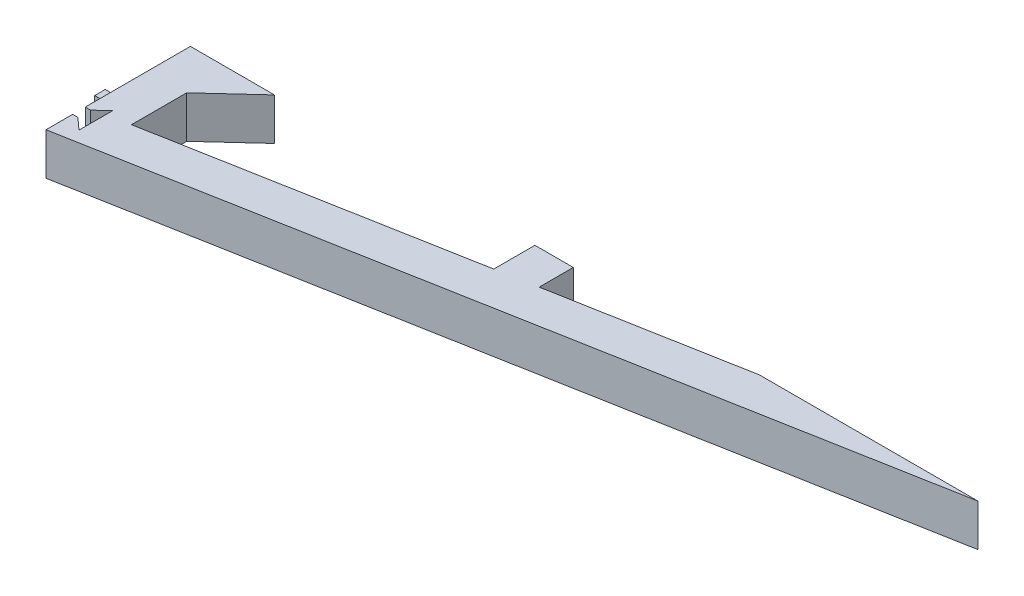
ISO-10303-21;
HEADER;
FILE_DESCRIPTION(('STEP AP214'),'2;1');
FILE_NAME('part.step','',(''),(''),'','','');
FILE_SCHEMA(('AUTOMOTIVE_DESIGN { 1 0 10303 214 1 1 1 1 }'));
ENDSEC;
DATA;
#1=APPLICATION_CONTEXT('core data for automotive mechanical design processes');
#2=APPLICATION_PROTOCOL_DEFINITION('international standard','automotive_design',2000,#1);
#3=PRODUCT_CONTEXT('',#1,'mechanical');
#4=PRODUCT('Part','Part','',(#3));
#5=PRODUCT_RELATED_PRODUCT_CATEGORY('part','',(#4));
#6=PRODUCT_DEFINITION_FORMATION('','',#4);
#7=PRODUCT_DEFINITION_CONTEXT('part definition',#1,'design');
#8=PRODUCT_DEFINITION('design','',#6,#7);
#9=PRODUCT_DEFINITION_SHAPE('','',#8);
#10=(LENGTH_UNIT() NAMED_UNIT(*) SI_UNIT(.MILLI.,.METRE.));
#11=(NAMED_UNIT(*) PLANE_ANGLE_UNIT() SI_UNIT($,.RADIAN.));
#12=(NAMED_UNIT(*) SI_UNIT($,.STERADIAN.) SOLID_ANGLE_UNIT());
#13=UNCERTAINTY_MEASURE_WITH_UNIT(LENGTH_MEASURE(1.E-05),#10,'distance_accuracy_value','');
#14=(GEOMETRIC_REPRESENTATION_CONTEXT(3) GLOBAL_UNCERTAINTY_ASSIGNED_CONTEXT((#13)) GLOBAL_UNIT_ASSIGNED_CONTEXT((#10,
#11,#12)) REPRESENTATION_CONTEXT('',''));
#15=CARTESIAN_POINT('',(0.,0.,0.));
#16=DIRECTION('',(0.,0.,1.));
#17=DIRECTION('',(1.,0.,0.));
#18=AXIS2_PLACEMENT_3D('',#15,#16,#17);
#19=CARTESIAN_POINT('',(0.,8.,0.));
#20=DIRECTION('',(1.,0.,0.));
#21=DIRECTION('',(0.,0.,-1.));
#22=AXIS2_PLACEMENT_3D('',#19,#20,#21);
#23=PLANE('',#22);
#24=DIRECTION('',(0.,1.,0.));
#25=VECTOR('',#24,1.);
#26=CARTESIAN_POINT('',(0.,0.,20.));
#27=LINE('',#26,#25);
#28=CARTESIAN_POINT('',(0.,0.,20.));
#29=VERTEX_POINT('',#28);
#30=CARTESIAN_POINT('',(0.,8.,20.));
#31=VERTEX_POINT('',#30);
#32=EDGE_CURVE('E226',#29,#31,#27,.T.);
#33=ORIENTED_EDGE('',*,*,#32,.T.);
#34=DIRECTION('',(0.,0.,1.));
#35=VECTOR('',#34,1.);
#36=CARTESIAN_POINT('',(0.,8.,0.));
#37=LINE('',#36,#35);
#38=CARTESIAN_POINT('',(0.,8.,0.));
#39=VERTEX_POINT('',#38);
#40=EDGE_CURVE('E198',#39,#31,#37,.T.);
#41=ORIENTED_EDGE('',*,*,#40,.F.);
#42=DIRECTION('',(0.,-1.,0.));
#43=VECTOR('',#42,1.);
#44=CARTESIAN_POINT('',(0.,8.,0.));
#45=LINE('',#44,#43);
#46=CARTESIAN_POINT('',(0.,0.,0.));
#47=VERTEX_POINT('',#46);
#48=EDGE_CURVE('E11',#39,#47,#45,.T.);
#49=ORIENTED_EDGE('',*,*,#48,.T.);
#50=DIRECTION('',(0.,0.,1.));
#51=VECTOR('',#50,1.);
#52=CARTESIAN_POINT('',(0.,0.,0.));
#53=LINE('',#52,#51);
#54=EDGE_CURVE('E227',#47,#29,#53,.T.);
#55=ORIENTED_EDGE('',*,*,#54,.T.);
#56=EDGE_LOOP('',(#33,#41,#49,#55));
#57=FACE_BOUND('',#56,.T.);
#58=DIRECTION('',(0.,-1.,0.));
#59=VECTOR('',#58,1.);
#60=CARTESIAN_POINT('',(0.,5.,12.2));
#61=LINE('',#60,#59);
#62=CARTESIAN_POINT('',(0.,5.,12.2));
#63=VERTEX_POINT('',#62);
#64=CARTESIAN_POINT('',(0.,3.,12.2));
#65=VERTEX_POINT('',#64);
#66=EDGE_CURVE('E362',#63,#65,#61,.T.);
#67=ORIENTED_EDGE('',*,*,#66,.F.);
#68=DIRECTION('',(0.,0.,-1.));
#69=VECTOR('',#68,1.);
#70=CARTESIAN_POINT('',(0.,5.,12.2));
#71=LINE('',#70,#69);
#72=CARTESIAN_POINT('',(0.,5.,14.2));
#73=VERTEX_POINT('',#72);
#74=EDGE_CURVE('E356',#73,#63,#71,.T.);
#75=ORIENTED_EDGE('',*,*,#74,.F.);
#76=DIRECTION('',(0.,1.,0.));
#77=VECTOR('',#76,1.);
#78=CARTESIAN_POINT('',(0.,5.,14.2));
#79=LINE('',#78,#77);
#80=CARTESIAN_POINT('',(0.,3.,14.2));
#81=VERTEX_POINT('',#80);
#82=EDGE_CURVE('E53',#81,#73,#79,.T.);
#83=ORIENTED_EDGE('',*,*,#82,.F.);
#84=DIRECTION('',(0.,0.,1.));
#85=VECTOR('',#84,1.);
#86=CARTESIAN_POINT('',(0.,3.,12.2));
#87=LINE('',#86,#85);
#88=EDGE_CURVE('E48',#65,#81,#87,.T.);
#89=ORIENTED_EDGE('',*,*,#88,.F.);
#90=EDGE_LOOP('',(#67,#75,#83,#89));
#91=FACE_BOUND('',#90,.T.);
#92=ADVANCED_FACE('F33',(#57,#91),#23,.F.);
#93=CARTESIAN_POINT('',(7.3,8.,0.));
#94=DIRECTION('',(0.,0.,1.));
#95=DIRECTION('',(1.,0.,0.));
#96=AXIS2_PLACEMENT_3D('',#93,#94,#95);
#97=PLANE('',#96);
#98=CARTESIAN_POINT('',(3.65,4.,0.));
#99=DIRECTION('',(0.,0.,-1.));
#100=DIRECTION('',(-1.,0.,0.));
#101=AXIS2_PLACEMENT_3D('',#98,#99,#100);
#102=CIRCLE('',#101,2.2);
#103=CARTESIAN_POINT('',(1.45,4.,0.));
#104=VERTEX_POINT('',#103);
#105=EDGE_CURVE('E381',#104,#104,#102,.T.);
#106=ORIENTED_EDGE('',*,*,#105,.F.);
#107=EDGE_LOOP('',(#106));
#108=FACE_BOUND('',#107,.T.);
#109=DIRECTION('',(-1.,0.,0.));
#110=VECTOR('',#109,1.);
#111=CARTESIAN_POINT('',(7.3,0.,0.));
#112=LINE('',#111,#110);
#113=CARTESIAN_POINT('',(16.,0.,0.));
#114=VERTEX_POINT('',#113);
#115=EDGE_CURVE('E223',#114,#47,#112,.T.);
#116=ORIENTED_EDGE('',*,*,#115,.T.);
#117=ORIENTED_EDGE('',*,*,#48,.F.);
#118=DIRECTION('',(-1.,0.,0.));
#119=VECTOR('',#118,1.);
#120=CARTESIAN_POINT('',(7.3,8.,0.));
#121=LINE('',#120,#119);
#122=CARTESIAN_POINT('',(16.,8.,0.));
#123=VERTEX_POINT('',#122);
#124=EDGE_CURVE('E190',#123,#39,#121,.T.);
#125=ORIENTED_EDGE('',*,*,#124,.F.);
#126=DIRECTION('',(0.,1.,0.));
#127=VECTOR('',#126,1.);
#128=CARTESIAN_POINT('',(16.,0.,0.));
#129=LINE('',#128,#127);
#130=EDGE_CURVE('E173',#114,#123,#129,.T.);
#131=ORIENTED_EDGE('',*,*,#130,.F.);
#132=EDGE_LOOP('',(#116,#117,#125,#131));
#133=FACE_BOUND('',#132,.T.);
#134=ADVANCED_FACE('F35',(#108,#133),#97,.F.);
#135=CARTESIAN_POINT('',(0.,8.,22.4));
#136=VERTEX_POINT('',#135);
#137=CARTESIAN_POINT('',(0.,8.,27.47211487));
#138=VERTEX_POINT('',#137);
#139=EDGE_CURVE('E195',#136,#138,#37,.T.);
#140=ORIENTED_EDGE('',*,*,#139,.F.);
#141=DIRECTION('',(0.,1.,0.));
#142=VECTOR('',#141,1.);
#143=CARTESIAN_POINT('',(0.,0.,22.4));
#144=LINE('',#143,#142);
#145=CARTESIAN_POINT('',(0.,0.,22.4));
#146=VERTEX_POINT('',#145);
#147=EDGE_CURVE('E204',#146,#136,#144,.T.);
#148=ORIENTED_EDGE('',*,*,#147,.F.);
#149=CARTESIAN_POINT('',(0.,0.,27.47211487));
#150=VERTEX_POINT('',#149);
#151=EDGE_CURVE('E225',#146,#150,#53,.T.);
#152=ORIENTED_EDGE('',*,*,#151,.T.);
#153=DIRECTION('',(0.,-1.,0.));
#154=VECTOR('',#153,1.);
#155=CARTESIAN_POINT('',(0.,8.,27.47211487));
#156=LINE('',#155,#154);
#157=EDGE_CURVE('E41',#138,#150,#156,.T.);
#158=ORIENTED_EDGE('',*,*,#157,.F.);
#159=EDGE_LOOP('',(#140,#148,#152,#158));
#160=FACE_BOUND('',#159,.T.);
#161=ADVANCED_FACE('F292',(#160),#23,.F.);
#162=CARTESIAN_POINT('',(0.,8.,27.47211487));
#163=DIRECTION('',(-0.180330309758335,0.,-0.983606109874508));
#164=DIRECTION('',(-0.983606109874508,0.,0.180330309758335));
#165=AXIS2_PLACEMENT_3D('',#162,#163,#164);
#166=PLANE('',#165);
#167=DIRECTION('',(0.983606109874508,0.,-0.180330309758335));
#168=VECTOR('',#167,1.);
#169=CARTESIAN_POINT('',(0.,0.,27.47211487));
#170=LINE('',#169,#168);
#171=CARTESIAN_POINT('',(149.85,0.,-0.000769494996585678));
#172=VERTEX_POINT('',#171);
#173=EDGE_CURVE('E229',#150,#172,#170,.T.);
#174=ORIENTED_EDGE('',*,*,#173,.T.);
#175=DIRECTION('',(0.,-1.,0.));
#176=VECTOR('',#175,1.);
#177=CARTESIAN_POINT('',(149.85,8.,-0.000769494996585678));
#178=LINE('',#177,#176);
#179=CARTESIAN_POINT('',(149.85,8.,-0.000769494996585678));
#180=VERTEX_POINT('',#179);
#181=EDGE_CURVE('E259',#180,#172,#178,.T.);
#182=ORIENTED_EDGE('',*,*,#181,.F.);
#183=DIRECTION('',(0.983606109874508,0.,-0.180330309758335));
#184=VECTOR('',#183,1.);
#185=CARTESIAN_POINT('',(0.,8.,27.47211487));
#186=LINE('',#185,#184);
#187=EDGE_CURVE('E207',#138,#180,#186,.T.);
#188=ORIENTED_EDGE('',*,*,#187,.F.);
#189=ORIENTED_EDGE('',*,*,#157,.T.);
#190=EDGE_LOOP('',(#174,#182,#188,#189));
#191=FACE_BOUND('',#190,.T.);
#192=ADVANCED_FACE('F266',(#191),#166,.F.);
#193=CARTESIAN_POINT('',(108.259653873212,8.,-0.000769494996586111));
#194=DIRECTION('',(0.,0.,1.));
#195=DIRECTION('',(1.,0.,0.));
#196=AXIS2_PLACEMENT_3D('',#193,#194,#195);
#197=PLANE('',#196);
#198=DIRECTION('',(-1.,0.,0.));
#199=VECTOR('',#198,1.);
#200=CARTESIAN_POINT('',(108.259653873212,0.,-0.000769494996586111));
#201=LINE('',#200,#199);
#202=CARTESIAN_POINT('',(108.259653873212,0.,-0.000769494996586111));
#203=VERTEX_POINT('',#202);
#204=EDGE_CURVE('E231',#172,#203,#201,.T.);
#205=ORIENTED_EDGE('',*,*,#204,.T.);
#206=DIRECTION('',(0.,-1.,0.));
#207=VECTOR('',#206,1.);
#208=CARTESIAN_POINT('',(108.259653873212,8.,-0.000769494996586111));
#209=LINE('',#208,#207);
#210=CARTESIAN_POINT('',(108.259653873212,8.,-0.000769494996586111));
#211=VERTEX_POINT('',#210);
#212=EDGE_CURVE('E256',#211,#203,#209,.T.);
#213=ORIENTED_EDGE('',*,*,#212,.F.);
#214=DIRECTION('',(-1.,0.,0.));
#215=VECTOR('',#214,1.);
#216=CARTESIAN_POINT('',(108.259653873212,8.,-0.000769494996586111));
#217=LINE('',#216,#215);
#218=EDGE_CURVE('E209',#180,#211,#217,.T.);
#219=ORIENTED_EDGE('',*,*,#218,.F.);
#220=ORIENTED_EDGE('',*,*,#181,.T.);
#221=EDGE_LOOP('',(#205,#213,#219,#220));
#222=FACE_BOUND('',#221,.T.);
#223=ADVANCED_FACE('F279',(#222),#197,.F.);
#224=CARTESIAN_POINT('',(72.85,8.,6.4910912074613));
#225=DIRECTION('',(0.180330309758335,0.,0.983606109874508));
#226=DIRECTION('',(0.983606109874508,0.,-0.180330309758335));
#227=AXIS2_PLACEMENT_3D('',#224,#225,#226);
#228=PLANE('',#227);
#229=DIRECTION('',(-0.983606109874508,0.,0.180330309758335));
#230=VECTOR('',#229,1.);
#231=CARTESIAN_POINT('',(72.85,0.,6.4910912074613));
#232=LINE('',#231,#230);
#233=CARTESIAN_POINT('',(72.85,0.,6.4910912074613));
#234=VERTEX_POINT('',#233);
#235=EDGE_CURVE('E233',#203,#234,#232,.T.);
#236=ORIENTED_EDGE('',*,*,#235,.T.);
#237=DIRECTION('',(0.,-1.,0.));
#238=VECTOR('',#237,1.);
#239=CARTESIAN_POINT('',(72.85,8.,6.4910912074613));
#240=LINE('',#239,#238);
#241=CARTESIAN_POINT('',(72.85,8.,6.4910912074613));
#242=VERTEX_POINT('',#241);
#243=EDGE_CURVE('E253',#242,#234,#240,.T.);
#244=ORIENTED_EDGE('',*,*,#243,.F.);
#245=DIRECTION('',(-0.983606109874508,0.,0.180330309758335));
#246=VECTOR('',#245,1.);
#247=CARTESIAN_POINT('',(72.85,8.,6.4910912074613));
#248=LINE('',#247,#246);
#249=EDGE_CURVE('E211',#211,#242,#248,.T.);
#250=ORIENTED_EDGE('',*,*,#249,.F.);
#251=ORIENTED_EDGE('',*,*,#212,.T.);
#252=EDGE_LOOP('',(#236,#244,#250,#251));
#253=FACE_BOUND('',#252,.T.);
#254=ADVANCED_FACE('F283',(#253),#228,.F.);
#255=CARTESIAN_POINT('',(72.85,8.,0.));
#256=DIRECTION('',(-1.,0.,0.));
#257=DIRECTION('',(0.,0.,1.));
#258=AXIS2_PLACEMENT_3D('',#255,#256,#257);
#259=PLANE('',#258);
#260=DIRECTION('',(0.,0.,-1.));
#261=VECTOR('',#260,1.);
#262=CARTESIAN_POINT('',(72.85,0.,0.));
#263=LINE('',#262,#261);
#264=CARTESIAN_POINT('',(72.85,0.,0.));
#265=VERTEX_POINT('',#264);
#266=EDGE_CURVE('E235',#234,#265,#263,.T.);
#267=ORIENTED_EDGE('',*,*,#266,.T.);
#268=DIRECTION('',(0.,-1.,0.));
#269=VECTOR('',#268,1.);
#270=CARTESIAN_POINT('',(72.85,8.,0.));
#271=LINE('',#270,#269);
#272=CARTESIAN_POINT('',(72.85,8.,0.));
#273=VERTEX_POINT('',#272);
#274=EDGE_CURVE('E250',#273,#265,#271,.T.);
#275=ORIENTED_EDGE('',*,*,#274,.F.);
#276=DIRECTION('',(0.,0.,-1.));
#277=VECTOR('',#276,1.);
#278=CARTESIAN_POINT('',(72.85,8.,0.));
#279=LINE('',#278,#277);
#280=EDGE_CURVE('E213',#242,#273,#279,.T.);
#281=ORIENTED_EDGE('',*,*,#280,.F.);
#282=ORIENTED_EDGE('',*,*,#243,.T.);
#283=EDGE_LOOP('',(#267,#275,#281,#282));
#284=FACE_BOUND('',#283,.T.);
#285=ADVANCED_FACE('F411',(#284),#259,.F.);
#286=CARTESIAN_POINT('',(65.55,8.,0.));
#287=DIRECTION('',(0.,0.,1.));
#288=DIRECTION('',(1.,0.,0.));
#289=AXIS2_PLACEMENT_3D('',#286,#287,#288);
#290=PLANE('',#289);
#291=CARTESIAN_POINT('',(69.2,4.,0.));
#292=DIRECTION('',(0.,0.,-1.));
#293=DIRECTION('',(-1.,0.,0.));
#294=AXIS2_PLACEMENT_3D('',#291,#292,#293);
#295=CIRCLE('',#294,2.2);
#296=CARTESIAN_POINT('',(67.,4.,0.));
#297=VERTEX_POINT('',#296);
#298=EDGE_CURVE('E375',#297,#297,#295,.T.);
#299=ORIENTED_EDGE('',*,*,#298,.F.);
#300=EDGE_LOOP('',(#299));
#301=FACE_BOUND('',#300,.T.);
#302=DIRECTION('',(-1.,0.,0.));
#303=VECTOR('',#302,1.);
#304=CARTESIAN_POINT('',(65.55,0.,0.));
#305=LINE('',#304,#303);
#306=CARTESIAN_POINT('',(65.55,0.,0.));
#307=VERTEX_POINT('',#306);
#308=EDGE_CURVE('E237',#265,#307,#305,.T.);
#309=ORIENTED_EDGE('',*,*,#308,.T.);
#310=DIRECTION('',(0.,-1.,0.));
#311=VECTOR('',#310,1.);
#312=CARTESIAN_POINT('',(65.55,8.,0.));
#313=LINE('',#312,#311);
#314=CARTESIAN_POINT('',(65.55,8.,0.));
#315=VERTEX_POINT('',#314);
#316=EDGE_CURVE('E247',#315,#307,#313,.T.);
#317=ORIENTED_EDGE('',*,*,#316,.F.);
#318=DIRECTION('',(-1.,0.,0.));
#319=VECTOR('',#318,1.);
#320=CARTESIAN_POINT('',(65.55,8.,0.));
#321=LINE('',#320,#319);
#322=EDGE_CURVE('E215',#273,#315,#321,.T.);
#323=ORIENTED_EDGE('',*,*,#322,.F.);
#324=ORIENTED_EDGE('',*,*,#274,.T.);
#325=EDGE_LOOP('',(#309,#317,#323,#324));
#326=FACE_BOUND('',#325,.T.);
#327=ADVANCED_FACE('F414',(#301,#326),#290,.F.);
#328=CARTESIAN_POINT('',(65.55,8.,7.82944326528229));
#329=DIRECTION('',(1.,0.,0.));
#330=DIRECTION('',(0.,0.,-1.));
#331=AXIS2_PLACEMENT_3D('',#328,#329,#330);
#332=PLANE('',#331);
#333=DIRECTION('',(0.,0.,1.));
#334=VECTOR('',#333,1.);
#335=CARTESIAN_POINT('',(65.55,0.,7.82944326528229));
#336=LINE('',#335,#334);
#337=CARTESIAN_POINT('',(65.55,0.,7.82944326528229));
#338=VERTEX_POINT('',#337);
#339=EDGE_CURVE('E239',#307,#338,#336,.T.);
#340=ORIENTED_EDGE('',*,*,#339,.T.);
#341=DIRECTION('',(0.,-1.,0.));
#342=VECTOR('',#341,1.);
#343=CARTESIAN_POINT('',(65.55,8.,7.82944326528229));
#344=LINE('',#343,#342);
#345=CARTESIAN_POINT('',(65.55,8.,7.82944326528229));
#346=VERTEX_POINT('',#345);
#347=EDGE_CURVE('E244',#346,#338,#344,.T.);
#348=ORIENTED_EDGE('',*,*,#347,.F.);
#349=DIRECTION('',(0.,0.,1.));
#350=VECTOR('',#349,1.);
#351=CARTESIAN_POINT('',(65.55,8.,7.82944326528229));
#352=LINE('',#351,#350);
#353=EDGE_CURVE('E217',#315,#346,#352,.T.);
#354=ORIENTED_EDGE('',*,*,#353,.F.);
#355=ORIENTED_EDGE('',*,*,#316,.T.);
#356=EDGE_LOOP('',(#340,#348,#354,#355));
#357=FACE_BOUND('',#356,.T.);
#358=ADVANCED_FACE('F418',(#357),#332,.F.);
#359=CARTESIAN_POINT('',(65.55,8.,7.82944326528229));
#360=DIRECTION('',(0.180330309758335,0.,0.983606109874508));
#361=DIRECTION('',(0.983606109874508,0.,-0.180330309758335));
#362=AXIS2_PLACEMENT_3D('',#359,#360,#361);
#363=PLANE('',#362);
#364=DIRECTION('',(-0.983606109874508,0.,0.180330309758335));
#365=VECTOR('',#364,1.);
#366=CARTESIAN_POINT('',(65.55,0.,7.82944326528229));
#367=LINE('',#366,#365);
#368=CARTESIAN_POINT('',(7.3,0.,18.5087593431005));
#369=VERTEX_POINT('',#368);
#370=EDGE_CURVE('E201',#338,#369,#367,.T.);
#371=ORIENTED_EDGE('',*,*,#370,.T.);
#372=DIRECTION('',(0.,-1.,0.));
#373=VECTOR('',#372,1.);
#374=CARTESIAN_POINT('',(7.3,8.,18.5087593431005));
#375=LINE('',#374,#373);
#376=CARTESIAN_POINT('',(7.3,8.,18.5087593431005));
#377=VERTEX_POINT('',#376);
#378=EDGE_CURVE('E222',#377,#369,#375,.T.);
#379=ORIENTED_EDGE('',*,*,#378,.F.);
#380=DIRECTION('',(-0.983606109874508,0.,0.180330309758335));
#381=VECTOR('',#380,1.);
#382=CARTESIAN_POINT('',(65.55,8.,7.82944326528229));
#383=LINE('',#382,#381);
#384=EDGE_CURVE('E219',#346,#377,#383,.T.);
#385=ORIENTED_EDGE('',*,*,#384,.F.);
#386=ORIENTED_EDGE('',*,*,#347,.T.);
#387=EDGE_LOOP('',(#371,#379,#385,#386));
#388=FACE_BOUND('',#387,.T.);
#389=ADVANCED_FACE('F422',(#388),#363,.F.);
#390=CARTESIAN_POINT('',(7.3,8.,18.5087593431005));
#391=DIRECTION('',(-1.,0.,0.));
#392=DIRECTION('',(0.,0.,1.));
#393=AXIS2_PLACEMENT_3D('',#390,#391,#392);
#394=PLANE('',#393);
#395=DIRECTION('',(0.,0.,-1.));
#396=VECTOR('',#395,1.);
#397=CARTESIAN_POINT('',(7.3,0.,18.5087593431005));
#398=LINE('',#397,#396);
#399=CARTESIAN_POINT('',(7.3,0.,8.));
#400=VERTEX_POINT('',#399);
#401=EDGE_CURVE('E196',#369,#400,#398,.T.);
#402=ORIENTED_EDGE('',*,*,#401,.T.);
#403=DIRECTION('',(0.,1.,0.));
#404=VECTOR('',#403,1.);
#405=CARTESIAN_POINT('',(7.3,8.,8.));
#406=LINE('',#405,#404);
#407=CARTESIAN_POINT('',(7.3,8.,8.));
#408=VERTEX_POINT('',#407);
#409=EDGE_CURVE('E184',#400,#408,#406,.T.);
#410=ORIENTED_EDGE('',*,*,#409,.T.);
#411=DIRECTION('',(0.,0.,-1.));
#412=VECTOR('',#411,1.);
#413=CARTESIAN_POINT('',(7.3,8.,18.5087593431005));
#414=LINE('',#413,#412);
#415=EDGE_CURVE('E193',#377,#408,#414,.T.);
#416=ORIENTED_EDGE('',*,*,#415,.F.);
#417=ORIENTED_EDGE('',*,*,#378,.T.);
#418=EDGE_LOOP('',(#402,#410,#416,#417));
#419=FACE_BOUND('',#418,.T.);
#420=ADVANCED_FACE('F426',(#419),#394,.F.);
#421=CARTESIAN_POINT('',(0.,8.,0.));
#422=DIRECTION('',(0.,1.,0.));
#423=DIRECTION('',(0.,0.,1.));
#424=AXIS2_PLACEMENT_3D('',#421,#422,#423);
#425=PLANE('',#424);
#426=DIRECTION('',(0.736099620693866,0.,-0.676873214431141));
#427=VECTOR('',#426,1.);
#428=CARTESIAN_POINT('',(16.,8.,0.));
#429=LINE('',#428,#427);
#430=EDGE_CURVE('E176',#408,#123,#429,.T.);
#431=ORIENTED_EDGE('',*,*,#430,.T.);
#432=ORIENTED_EDGE('',*,*,#124,.T.);
#433=ORIENTED_EDGE('',*,*,#40,.T.);
#434=DIRECTION('',(-1.,0.,0.));
#435=VECTOR('',#434,1.);
#436=CARTESIAN_POINT('',(0.,8.,20.));
#437=LINE('',#436,#435);
#438=CARTESIAN_POINT('',(1.,8.,20.));
#439=VERTEX_POINT('',#438);
#440=EDGE_CURVE('E317',#439,#31,#437,.T.);
#441=ORIENTED_EDGE('',*,*,#440,.F.);
#442=DIRECTION('',(-0.739940073395944,0.,0.672672793996312));
#443=VECTOR('',#442,1.);
#444=CARTESIAN_POINT('',(1.,8.,20.));
#445=LINE('',#444,#443);
#446=CARTESIAN_POINT('',(3.2,8.,18.));
#447=VERTEX_POINT('',#446);
#448=EDGE_CURVE('E314',#447,#439,#445,.T.);
#449=ORIENTED_EDGE('',*,*,#448,.F.);
#450=DIRECTION('',(0.,0.,-1.));
#451=VECTOR('',#450,1.);
#452=CARTESIAN_POINT('',(3.2,8.,18.));
#453=LINE('',#452,#451);
#454=CARTESIAN_POINT('',(3.2,8.,24.4));
#455=VERTEX_POINT('',#454);
#456=EDGE_CURVE('E311',#455,#447,#453,.T.);
#457=ORIENTED_EDGE('',*,*,#456,.F.);
#458=DIRECTION('',(0.739940073395943,0.,0.672672793996313));
#459=VECTOR('',#458,1.);
#460=CARTESIAN_POINT('',(3.2,8.,24.4));
#461=LINE('',#460,#459);
#462=CARTESIAN_POINT('',(1.,8.,22.4));
#463=VERTEX_POINT('',#462);
#464=EDGE_CURVE('E307',#463,#455,#461,.T.);
#465=ORIENTED_EDGE('',*,*,#464,.F.);
#466=DIRECTION('',(1.,0.,0.));
#467=VECTOR('',#466,1.);
#468=CARTESIAN_POINT('',(1.,8.,22.4));
#469=LINE('',#468,#467);
#470=EDGE_CURVE('E290',#136,#463,#469,.T.);
#471=ORIENTED_EDGE('',*,*,#470,.F.);
#472=ORIENTED_EDGE('',*,*,#139,.T.);
#473=ORIENTED_EDGE('',*,*,#187,.T.);
#474=ORIENTED_EDGE('',*,*,#218,.T.);
#475=ORIENTED_EDGE('',*,*,#249,.T.);
#476=ORIENTED_EDGE('',*,*,#280,.T.);
#477=ORIENTED_EDGE('',*,*,#322,.T.);
#478=ORIENTED_EDGE('',*,*,#353,.T.);
#479=ORIENTED_EDGE('',*,*,#384,.T.);
#480=ORIENTED_EDGE('',*,*,#415,.T.);
#481=EDGE_LOOP('',(#431,#432,#433,#441,#449,#457,#465,#471,#472,#473,#474,#475,#476,#477,#478,
#479,#480));
#482=FACE_BOUND('',#481,.T.);
#483=ADVANCED_FACE('F189',(#482),#425,.T.);
#484=CARTESIAN_POINT('',(0.,0.,0.));
#485=DIRECTION('',(0.,1.,0.));
#486=DIRECTION('',(0.,0.,1.));
#487=AXIS2_PLACEMENT_3D('',#484,#485,#486);
#488=PLANE('',#487);
#489=ORIENTED_EDGE('',*,*,#115,.F.);
#490=DIRECTION('',(0.736099620693866,0.,-0.676873214431141));
#491=VECTOR('',#490,1.);
#492=CARTESIAN_POINT('',(16.,0.,0.));
#493=LINE('',#492,#491);
#494=EDGE_CURVE('E179',#400,#114,#493,.T.);
#495=ORIENTED_EDGE('',*,*,#494,.F.);
#496=ORIENTED_EDGE('',*,*,#401,.F.);
#497=ORIENTED_EDGE('',*,*,#370,.F.);
#498=ORIENTED_EDGE('',*,*,#339,.F.);
#499=ORIENTED_EDGE('',*,*,#308,.F.);
#500=ORIENTED_EDGE('',*,*,#266,.F.);
#501=ORIENTED_EDGE('',*,*,#235,.F.);
#502=ORIENTED_EDGE('',*,*,#204,.F.);
#503=ORIENTED_EDGE('',*,*,#173,.F.);
#504=ORIENTED_EDGE('',*,*,#151,.F.);
#505=DIRECTION('',(1.,0.,0.));
#506=VECTOR('',#505,1.);
#507=CARTESIAN_POINT('',(1.,0.,22.4));
#508=LINE('',#507,#506);
#509=CARTESIAN_POINT('',(1.,0.,22.4));
#510=VERTEX_POINT('',#509);
#511=EDGE_CURVE('E320',#146,#510,#508,.T.);
#512=ORIENTED_EDGE('',*,*,#511,.T.);
#513=DIRECTION('',(0.739940073395943,0.,0.672672793996313));
#514=VECTOR('',#513,1.);
#515=CARTESIAN_POINT('',(3.2,0.,24.4));
#516=LINE('',#515,#514);
#517=CARTESIAN_POINT('',(3.2,0.,24.4));
#518=VERTEX_POINT('',#517);
#519=EDGE_CURVE('E341',#510,#518,#516,.T.);
#520=ORIENTED_EDGE('',*,*,#519,.T.);
#521=DIRECTION('',(0.,0.,-1.));
#522=VECTOR('',#521,1.);
#523=CARTESIAN_POINT('',(3.2,0.,18.));
#524=LINE('',#523,#522);
#525=CARTESIAN_POINT('',(3.2,0.,18.));
#526=VERTEX_POINT('',#525);
#527=EDGE_CURVE('E302',#518,#526,#524,.T.);
#528=ORIENTED_EDGE('',*,*,#527,.T.);
#529=DIRECTION('',(-0.739940073395944,0.,0.672672793996312));
#530=VECTOR('',#529,1.);
#531=CARTESIAN_POINT('',(1.,0.,20.));
#532=LINE('',#531,#530);
#533=CARTESIAN_POINT('',(1.,0.,20.));
#534=VERTEX_POINT('',#533);
#535=EDGE_CURVE('E298',#526,#534,#532,.T.);
#536=ORIENTED_EDGE('',*,*,#535,.T.);
#537=DIRECTION('',(-1.,0.,0.));
#538=VECTOR('',#537,1.);
#539=CARTESIAN_POINT('',(0.,0.,20.));
#540=LINE('',#539,#538);
#541=EDGE_CURVE('E295',#534,#29,#540,.T.);
#542=ORIENTED_EDGE('',*,*,#541,.T.);
#543=ORIENTED_EDGE('',*,*,#54,.F.);
#544=EDGE_LOOP('',(#489,#495,#496,#497,#498,#499,#500,#501,#502,#503,#504,#512,#520,#528,#536,
#542,#543));
#545=FACE_BOUND('',#544,.T.);
#546=ADVANCED_FACE('F273',(#545),#488,.F.);
#547=CARTESIAN_POINT('',(0.,0.,20.));
#548=DIRECTION('',(0.,0.,-1.));
#549=DIRECTION('',(-1.,0.,0.));
#550=AXIS2_PLACEMENT_3D('',#547,#548,#549);
#551=PLANE('',#550);
#552=ORIENTED_EDGE('',*,*,#440,.T.);
#553=ORIENTED_EDGE('',*,*,#32,.F.);
#554=ORIENTED_EDGE('',*,*,#541,.F.);
#555=DIRECTION('',(0.,1.,0.));
#556=VECTOR('',#555,1.);
#557=CARTESIAN_POINT('',(1.,0.,20.));
#558=LINE('',#557,#556);
#559=EDGE_CURVE('E323',#534,#439,#558,.T.);
#560=ORIENTED_EDGE('',*,*,#559,.T.);
#561=EDGE_LOOP('',(#552,#553,#554,#560));
#562=FACE_BOUND('',#561,.T.);
#563=ADVANCED_FACE('F433',(#562),#551,.F.);
#564=CARTESIAN_POINT('',(1.,0.,20.));
#565=DIRECTION('',(-0.672672793996312,0.,-0.739940073395944));
#566=DIRECTION('',(-0.739940073395944,0.,0.672672793996312));
#567=AXIS2_PLACEMENT_3D('',#564,#565,#566);
#568=PLANE('',#567);
#569=ORIENTED_EDGE('',*,*,#448,.T.);
#570=ORIENTED_EDGE('',*,*,#559,.F.);
#571=ORIENTED_EDGE('',*,*,#535,.F.);
#572=DIRECTION('',(0.,1.,0.));
#573=VECTOR('',#572,1.);
#574=CARTESIAN_POINT('',(3.2,0.,18.));
#575=LINE('',#574,#573);
#576=EDGE_CURVE('E325',#526,#447,#575,.T.);
#577=ORIENTED_EDGE('',*,*,#576,.T.);
#578=EDGE_LOOP('',(#569,#570,#571,#577));
#579=FACE_BOUND('',#578,.T.);
#580=ADVANCED_FACE('F339',(#579),#568,.F.);
#581=CARTESIAN_POINT('',(3.2,0.,18.));
#582=DIRECTION('',(1.,0.,0.));
#583=DIRECTION('',(0.,0.,-1.));
#584=AXIS2_PLACEMENT_3D('',#581,#582,#583);
#585=PLANE('',#584);
#586=ORIENTED_EDGE('',*,*,#456,.T.);
#587=ORIENTED_EDGE('',*,*,#576,.F.);
#588=ORIENTED_EDGE('',*,*,#527,.F.);
#589=DIRECTION('',(0.,1.,0.));
#590=VECTOR('',#589,1.);
#591=CARTESIAN_POINT('',(3.2,0.,24.4));
#592=LINE('',#591,#590);
#593=EDGE_CURVE('E296',#518,#455,#592,.T.);
#594=ORIENTED_EDGE('',*,*,#593,.T.);
#595=EDGE_LOOP('',(#586,#587,#588,#594));
#596=FACE_BOUND('',#595,.T.);
#597=ADVANCED_FACE('F329',(#596),#585,.F.);
#598=CARTESIAN_POINT('',(3.2,0.,24.4));
#599=DIRECTION('',(-0.672672793996313,0.,0.739940073395944));
#600=DIRECTION('',(0.739940073395944,0.,0.672672793996313));
#601=AXIS2_PLACEMENT_3D('',#598,#599,#600);
#602=PLANE('',#601);
#603=ORIENTED_EDGE('',*,*,#464,.T.);
#604=ORIENTED_EDGE('',*,*,#593,.F.);
#605=ORIENTED_EDGE('',*,*,#519,.F.);
#606=DIRECTION('',(0.,1.,0.));
#607=VECTOR('',#606,1.);
#608=CARTESIAN_POINT('',(1.,0.,22.4));
#609=LINE('',#608,#607);
#610=EDGE_CURVE('E294',#510,#463,#609,.T.);
#611=ORIENTED_EDGE('',*,*,#610,.T.);
#612=EDGE_LOOP('',(#603,#604,#605,#611));
#613=FACE_BOUND('',#612,.T.);
#614=ADVANCED_FACE('F335',(#613),#602,.F.);
#615=CARTESIAN_POINT('',(1.,0.,22.4));
#616=DIRECTION('',(0.,0.,1.));
#617=DIRECTION('',(1.,0.,0.));
#618=AXIS2_PLACEMENT_3D('',#615,#616,#617);
#619=PLANE('',#618);
#620=ORIENTED_EDGE('',*,*,#470,.T.);
#621=ORIENTED_EDGE('',*,*,#610,.F.);
#622=ORIENTED_EDGE('',*,*,#511,.F.);
#623=ORIENTED_EDGE('',*,*,#147,.T.);
#624=EDGE_LOOP('',(#620,#621,#622,#623));
#625=FACE_BOUND('',#624,.T.);
#626=ADVANCED_FACE('F436',(#625),#619,.F.);
#627=CARTESIAN_POINT('',(-4.,5.,12.2));
#628=DIRECTION('',(0.,0.,1.));
#629=DIRECTION('',(1.,0.,0.));
#630=AXIS2_PLACEMENT_3D('',#627,#628,#629);
#631=PLANE('',#630);
#632=ORIENTED_EDGE('',*,*,#66,.T.);
#633=DIRECTION('',(1.,0.,0.));
#634=VECTOR('',#633,1.);
#635=CARTESIAN_POINT('',(-4.,3.,12.2));
#636=LINE('',#635,#634);
#637=CARTESIAN_POINT('',(-4.,3.,12.2));
#638=VERTEX_POINT('',#637);
#639=EDGE_CURVE('E308',#638,#65,#636,.T.);
#640=ORIENTED_EDGE('',*,*,#639,.F.);
#641=DIRECTION('',(0.,-1.,0.));
#642=VECTOR('',#641,1.);
#643=CARTESIAN_POINT('',(-4.,5.,12.2));
#644=LINE('',#643,#642);
#645=CARTESIAN_POINT('',(-4.,5.,12.2));
#646=VERTEX_POINT('',#645);
#647=EDGE_CURVE('E359',#646,#638,#644,.T.);
#648=ORIENTED_EDGE('',*,*,#647,.F.);
#649=DIRECTION('',(1.,0.,0.));
#650=VECTOR('',#649,1.);
#651=CARTESIAN_POINT('',(-4.,5.,12.2));
#652=LINE('',#651,#650);
#653=EDGE_CURVE('E352',#646,#63,#652,.T.);
#654=ORIENTED_EDGE('',*,*,#653,.T.);
#655=EDGE_LOOP('',(#632,#640,#648,#654));
#656=FACE_BOUND('',#655,.T.);
#657=ADVANCED_FACE('F439',(#656),#631,.F.);
#658=CARTESIAN_POINT('',(-4.,3.,12.2));
#659=DIRECTION('',(0.,1.,0.));
#660=DIRECTION('',(0.,0.,1.));
#661=AXIS2_PLACEMENT_3D('',#658,#659,#660);
#662=PLANE('',#661);
#663=ORIENTED_EDGE('',*,*,#88,.T.);
#664=DIRECTION('',(1.,0.,0.));
#665=VECTOR('',#664,1.);
#666=CARTESIAN_POINT('',(-4.,3.,14.2));
#667=LINE('',#666,#665);
#668=CARTESIAN_POINT('',(-4.,3.,14.2));
#669=VERTEX_POINT('',#668);
#670=EDGE_CURVE('E346',#669,#81,#667,.T.);
#671=ORIENTED_EDGE('',*,*,#670,.F.);
#672=DIRECTION('',(0.,0.,1.));
#673=VECTOR('',#672,1.);
#674=CARTESIAN_POINT('',(-4.,3.,12.2));
#675=LINE('',#674,#673);
#676=EDGE_CURVE('E368',#638,#669,#675,.T.);
#677=ORIENTED_EDGE('',*,*,#676,.F.);
#678=ORIENTED_EDGE('',*,*,#639,.T.);
#679=EDGE_LOOP('',(#663,#671,#677,#678));
#680=FACE_BOUND('',#679,.T.);
#681=ADVANCED_FACE('F451',(#680),#662,.F.);
#682=CARTESIAN_POINT('',(-4.,5.,14.2));
#683=DIRECTION('',(0.,0.,-1.));
#684=DIRECTION('',(-1.,0.,0.));
#685=AXIS2_PLACEMENT_3D('',#682,#683,#684);
#686=PLANE('',#685);
#687=ORIENTED_EDGE('',*,*,#82,.T.);
#688=DIRECTION('',(1.,0.,0.));
#689=VECTOR('',#688,1.);
#690=CARTESIAN_POINT('',(-4.,5.,14.2));
#691=LINE('',#690,#689);
#692=CARTESIAN_POINT('',(-4.,5.,14.2));
#693=VERTEX_POINT('',#692);
#694=EDGE_CURVE('E349',#693,#73,#691,.T.);
#695=ORIENTED_EDGE('',*,*,#694,.F.);
#696=DIRECTION('',(0.,1.,0.));
#697=VECTOR('',#696,1.);
#698=CARTESIAN_POINT('',(-4.,5.,14.2));
#699=LINE('',#698,#697);
#700=EDGE_CURVE('E366',#669,#693,#699,.T.);
#701=ORIENTED_EDGE('',*,*,#700,.F.);
#702=ORIENTED_EDGE('',*,*,#670,.T.);
#703=EDGE_LOOP('',(#687,#695,#701,#702));
#704=FACE_BOUND('',#703,.T.);
#705=ADVANCED_FACE('F455',(#704),#686,.F.);
#706=CARTESIAN_POINT('',(-4.,5.,12.2));
#707=DIRECTION('',(0.,-1.,0.));
#708=DIRECTION('',(0.,0.,-1.));
#709=AXIS2_PLACEMENT_3D('',#706,#707,#708);
#710=PLANE('',#709);
#711=ORIENTED_EDGE('',*,*,#74,.T.);
#712=ORIENTED_EDGE('',*,*,#653,.F.);
#713=DIRECTION('',(0.,0.,-1.));
#714=VECTOR('',#713,1.);
#715=CARTESIAN_POINT('',(-4.,5.,12.2));
#716=LINE('',#715,#714);
#717=EDGE_CURVE('E355',#693,#646,#716,.T.);
#718=ORIENTED_EDGE('',*,*,#717,.F.);
#719=ORIENTED_EDGE('',*,*,#694,.T.);
#720=EDGE_LOOP('',(#711,#712,#718,#719));
#721=FACE_BOUND('',#720,.T.);
#722=ADVANCED_FACE('F459',(#721),#710,.F.);
#723=CARTESIAN_POINT('',(-4.,0.,0.));
#724=DIRECTION('',(-1.,0.,0.));
#725=DIRECTION('',(0.,0.,1.));
#726=AXIS2_PLACEMENT_3D('',#723,#724,#725);
#727=PLANE('',#726);
#728=ORIENTED_EDGE('',*,*,#647,.T.);
#729=ORIENTED_EDGE('',*,*,#676,.T.);
#730=ORIENTED_EDGE('',*,*,#700,.T.);
#731=ORIENTED_EDGE('',*,*,#717,.T.);
#732=EDGE_LOOP('',(#728,#729,#730,#731));
#733=FACE_BOUND('',#732,.T.);
#734=ADVANCED_FACE('F463',(#733),#727,.T.);
#735=CARTESIAN_POINT('',(16.,8.,0.));
#736=DIRECTION('',(-0.676873214431141,0.,-0.736099620693866));
#737=DIRECTION('',(-0.736099620693866,0.,0.676873214431141));
#738=AXIS2_PLACEMENT_3D('',#735,#736,#737);
#739=PLANE('',#738);
#740=ORIENTED_EDGE('',*,*,#494,.T.);
#741=ORIENTED_EDGE('',*,*,#130,.T.);
#742=ORIENTED_EDGE('',*,*,#430,.F.);
#743=ORIENTED_EDGE('',*,*,#409,.F.);
#744=EDGE_LOOP('',(#740,#741,#742,#743));
#745=FACE_BOUND('',#744,.T.);
#746=ADVANCED_FACE('F175',(#745),#739,.F.);
#747=CARTESIAN_POINT('',(69.2,4.,9.4));
#748=DIRECTION('',(0.,0.,-1.));
#749=DIRECTION('',(-1.,0.,0.));
#750=AXIS2_PLACEMENT_3D('',#747,#748,#749);
#751=CYLINDRICAL_SURFACE('',#750,2.2);
#752=CARTESIAN_POINT('',(69.2,4.,9.4));
#753=DIRECTION('',(0.,0.,-1.));
#754=DIRECTION('',(-1.,0.,0.));
#755=AXIS2_PLACEMENT_3D('',#752,#753,#754);
#756=CIRCLE('',#755,2.2);
#757=CARTESIAN_POINT('',(67.,4.,9.4));
#758=VERTEX_POINT('',#757);
#759=EDGE_CURVE('E378',#758,#758,#756,.T.);
#760=ORIENTED_EDGE('',*,*,#759,.F.);
#761=EDGE_LOOP('',(#760));
#762=FACE_BOUND('',#761,.T.);
#763=ORIENTED_EDGE('',*,*,#298,.T.);
#764=EDGE_LOOP('',(#763));
#765=FACE_BOUND('',#764,.T.);
#766=ADVANCED_FACE('F470',(#762,#765),#751,.F.);
#767=CARTESIAN_POINT('',(69.2,4.,9.4));
#768=DIRECTION('',(0.,0.,-1.));
#769=DIRECTION('',(-1.,0.,0.));
#770=AXIS2_PLACEMENT_3D('',#767,#768,#769);
#771=PLANE('',#770);
#772=ORIENTED_EDGE('',*,*,#759,.T.);
#773=EDGE_LOOP('',(#772));
#774=FACE_BOUND('',#773,.T.);
#775=ADVANCED_FACE('F392',(#774),#771,.T.);
#776=CARTESIAN_POINT('',(3.65,4.,9.4));
#777=DIRECTION('',(0.,0.,-1.));
#778=DIRECTION('',(-1.,0.,0.));
#779=AXIS2_PLACEMENT_3D('',#776,#777,#778);
#780=CYLINDRICAL_SURFACE('',#779,2.2);
#781=CARTESIAN_POINT('',(3.65,4.,9.4));
#782=DIRECTION('',(0.,0.,-1.));
#783=DIRECTION('',(-1.,0.,0.));
#784=AXIS2_PLACEMENT_3D('',#781,#782,#783);
#785=CIRCLE('',#784,2.2);
#786=CARTESIAN_POINT('',(1.45,4.,9.4));
#787=VERTEX_POINT('',#786);
#788=EDGE_CURVE('E373',#787,#787,#785,.T.);
#789=ORIENTED_EDGE('',*,*,#788,.F.);
#790=EDGE_LOOP('',(#789));
#791=FACE_BOUND('',#790,.T.);
#792=ORIENTED_EDGE('',*,*,#105,.T.);
#793=EDGE_LOOP('',(#792));
#794=FACE_BOUND('',#793,.T.);
#795=ADVANCED_FACE('F389',(#791,#794),#780,.F.);
#796=CARTESIAN_POINT('',(3.65,4.,9.4));
#797=DIRECTION('',(0.,0.,-1.));
#798=DIRECTION('',(-1.,0.,0.));
#799=AXIS2_PLACEMENT_3D('',#796,#797,#798);
#800=PLANE('',#799);
#801=ORIENTED_EDGE('',*,*,#788,.T.);
#802=EDGE_LOOP('',(#801));
#803=FACE_BOUND('',#802,.T.);
#804=ADVANCED_FACE('F387',(#803),#800,.T.);
#805=CLOSED_SHELL('',(#92,#134,#161,#192,#223,#254,#285,#327,#358,#389,#420,#483,#546,#563,#580,
#597,#614,#626,#657,#681,#705,#722,#734,#746,#766,#775,#795,#804));
#806=MANIFOLD_SOLID_BREP('B2',#805);
#807=ADVANCED_BREP_SHAPE_REPRESENTATION('',(#18,#806),#14);
#808=SHAPE_DEFINITION_REPRESENTATION(#9,#807);
ENDSEC;
END-ISO-10303-21;
